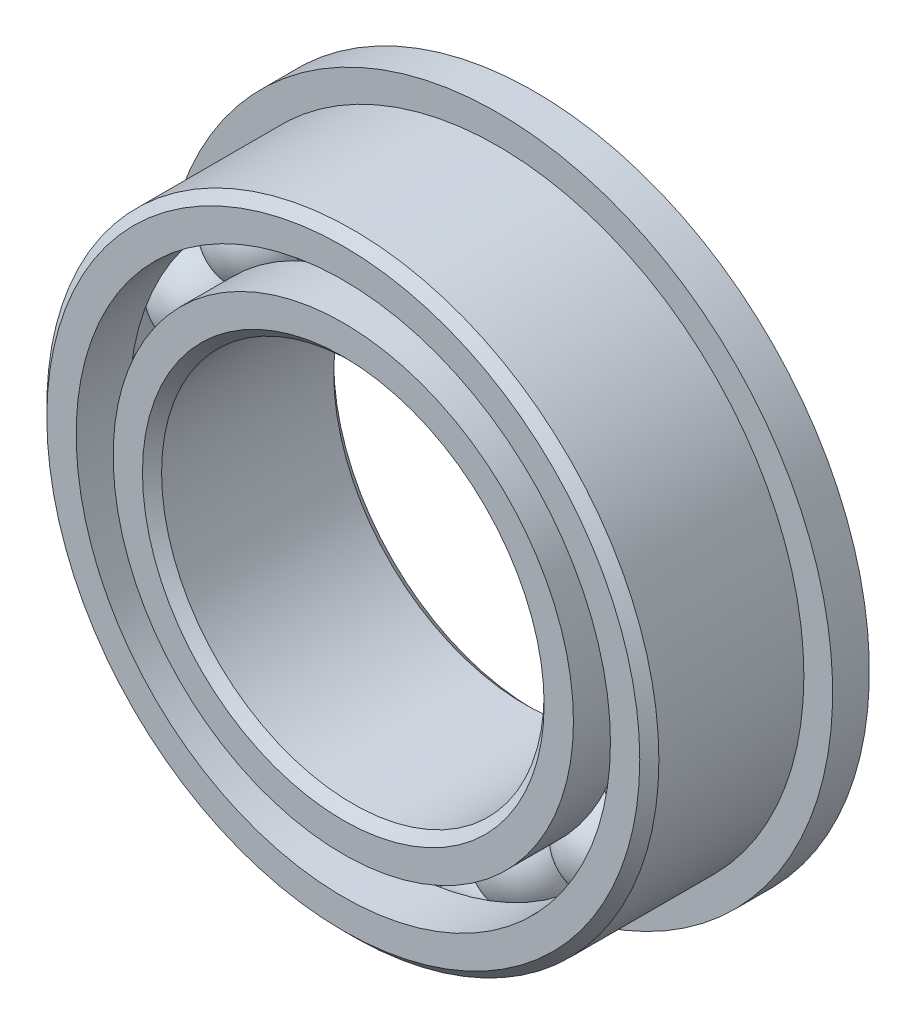
ISO-10303-21;
HEADER;
FILE_DESCRIPTION(('STEP AP214'),'2;1');
FILE_NAME('part.step','',(''),(''),'','','');
FILE_SCHEMA(('AUTOMOTIVE_DESIGN { 1 0 10303 214 1 1 1 1 }'));
ENDSEC;
DATA;
#1=APPLICATION_CONTEXT('core data for automotive mechanical design processes');
#2=APPLICATION_PROTOCOL_DEFINITION('international standard','automotive_design',2000,#1);
#3=PRODUCT_CONTEXT('',#1,'mechanical');
#4=PRODUCT('Part','Part','',(#3));
#5=PRODUCT_RELATED_PRODUCT_CATEGORY('part','',(#4));
#6=PRODUCT_DEFINITION_FORMATION('','',#4);
#7=PRODUCT_DEFINITION_CONTEXT('part definition',#1,'design');
#8=PRODUCT_DEFINITION('design','',#6,#7);
#9=PRODUCT_DEFINITION_SHAPE('','',#8);
#10=(LENGTH_UNIT() NAMED_UNIT(*) SI_UNIT(.MILLI.,.METRE.));
#11=(NAMED_UNIT(*) PLANE_ANGLE_UNIT() SI_UNIT($,.RADIAN.));
#12=(NAMED_UNIT(*) SI_UNIT($,.STERADIAN.) SOLID_ANGLE_UNIT());
#13=UNCERTAINTY_MEASURE_WITH_UNIT(LENGTH_MEASURE(1.E-05),#10,'distance_accuracy_value','');
#14=(GEOMETRIC_REPRESENTATION_CONTEXT(3) GLOBAL_UNCERTAINTY_ASSIGNED_CONTEXT((#13)) GLOBAL_UNIT_ASSIGNED_CONTEXT((#10,
#11,#12)) REPRESENTATION_CONTEXT('',''));
#15=CARTESIAN_POINT('',(0.,0.,0.));
#16=DIRECTION('',(0.,0.,1.));
#17=DIRECTION('',(1.,0.,0.));
#18=AXIS2_PLACEMENT_3D('',#15,#16,#17);
#19=CARTESIAN_POINT('',(-1.97440733385857,4.76664096305045,0.));
#20=DIRECTION('',(0.,0.,1.));
#21=DIRECTION('',(-0.382683432365077,0.923879532511292,0.));
#22=AXIS2_PLACEMENT_3D('',#19,#20,#21);
#23=SPHERICAL_SURFACE('',#22,0.961832467237323);
#24=CARTESIAN_POINT('',(-1.97440733385857,4.76664096305045,0.961832467237324));
#25=VERTEX_POINT('',#24);
#26=VERTEX_LOOP('',#25);
#27=FACE_BOUND('',#26,.T.);
#28=ADVANCED_FACE('F44',(#27),#23,.T.);
#29=CLOSED_SHELL('',(#28));
#30=MANIFOLD_SOLID_BREP('B2',#29);
#31=CARTESIAN_POINT('',(-3.6482290491843,3.64822904918439,0.));
#32=DIRECTION('',(0.,0.,1.));
#33=DIRECTION('',(-0.707106781186539,0.707106781186556,0.));
#34=AXIS2_PLACEMENT_3D('',#31,#32,#33);
#35=SPHERICAL_SURFACE('',#34,0.961832467237323);
#36=CARTESIAN_POINT('',(-3.6482290491843,3.64822904918439,0.961832467237324));
#37=VERTEX_POINT('',#36);
#38=VERTEX_LOOP('',#37);
#39=FACE_BOUND('',#38,.T.);
#40=ADVANCED_FACE('F65',(#39),#35,.T.);
#41=CLOSED_SHELL('',(#40));
#42=MANIFOLD_SOLID_BREP('B6',#41);
#43=CARTESIAN_POINT('',(-4.7666409630504,1.97440733385869,0.));
#44=DIRECTION('',(0.,0.,1.));
#45=DIRECTION('',(-0.923879532511283,0.3826834323651,0.));
#46=AXIS2_PLACEMENT_3D('',#43,#44,#45);
#47=SPHERICAL_SURFACE('',#46,0.961832467237323);
#48=CARTESIAN_POINT('',(-4.7666409630504,1.97440733385869,0.961832467237324));
#49=VERTEX_POINT('',#48);
#50=VERTEX_LOOP('',#49);
#51=FACE_BOUND('',#50,.T.);
#52=ADVANCED_FACE('F86',(#51),#47,.T.);
#53=CLOSED_SHELL('',(#52));
#54=MANIFOLD_SOLID_BREP('B40',#53);
#55=CARTESIAN_POINT('',(-5.159375,0.,0.));
#56=DIRECTION('',(0.,0.,1.));
#57=DIRECTION('',(-1.,0.,0.));
#58=AXIS2_PLACEMENT_3D('',#55,#56,#57);
#59=SPHERICAL_SURFACE('',#58,0.961832467237323);
#60=CARTESIAN_POINT('',(-5.159375,0.,0.961832467237324));
#61=VERTEX_POINT('',#60);
#62=VERTEX_LOOP('',#61);
#63=FACE_BOUND('',#62,.T.);
#64=ADVANCED_FACE('F107',(#63),#59,.T.);
#65=CLOSED_SHELL('',(#64));
#66=MANIFOLD_SOLID_BREP('B61',#65);
#67=CARTESIAN_POINT('',(-4.76664096305044,-1.97440733385859,0.));
#68=DIRECTION('',(0.,0.,1.));
#69=DIRECTION('',(-0.923879532511291,-0.382683432365081,0.));
#70=AXIS2_PLACEMENT_3D('',#67,#68,#69);
#71=SPHERICAL_SURFACE('',#70,0.961832467237323);
#72=CARTESIAN_POINT('',(-4.76664096305044,-1.97440733385859,0.961832467237324));
#73=VERTEX_POINT('',#72);
#74=VERTEX_LOOP('',#73);
#75=FACE_BOUND('',#74,.T.);
#76=ADVANCED_FACE('F128',(#75),#71,.T.);
#77=CLOSED_SHELL('',(#76));
#78=MANIFOLD_SOLID_BREP('B82',#77);
#79=CARTESIAN_POINT('',(-3.64822904918437,-3.64822904918431,0.));
#80=DIRECTION('',(0.,0.,1.));
#81=DIRECTION('',(-0.707106781186554,-0.707106781186541,0.));
#82=AXIS2_PLACEMENT_3D('',#79,#80,#81);
#83=SPHERICAL_SURFACE('',#82,0.961832467237323);
#84=CARTESIAN_POINT('',(-3.64822904918437,-3.64822904918431,0.961832467237324));
#85=VERTEX_POINT('',#84);
#86=VERTEX_LOOP('',#85);
#87=FACE_BOUND('',#86,.T.);
#88=ADVANCED_FACE('F149',(#87),#83,.T.);
#89=CLOSED_SHELL('',(#88));
#90=MANIFOLD_SOLID_BREP('B103',#89);
#91=CARTESIAN_POINT('',(-1.97440733385867,-4.7666409630504,0.));
#92=DIRECTION('',(0.,0.,1.));
#93=DIRECTION('',(-0.382683432365097,-0.923879532511284,0.));
#94=AXIS2_PLACEMENT_3D('',#91,#92,#93);
#95=SPHERICAL_SURFACE('',#94,0.961832467237323);
#96=CARTESIAN_POINT('',(-1.97440733385867,-4.7666409630504,0.961832467237324));
#97=VERTEX_POINT('',#96);
#98=VERTEX_LOOP('',#97);
#99=FACE_BOUND('',#98,.T.);
#100=ADVANCED_FACE('F170',(#99),#95,.T.);
#101=CLOSED_SHELL('',(#100));
#102=MANIFOLD_SOLID_BREP('B124',#101);
#103=CARTESIAN_POINT('',(0.,-5.159375,0.));
#104=DIRECTION('',(0.,0.,1.));
#105=DIRECTION('',(0.,-1.,0.));
#106=AXIS2_PLACEMENT_3D('',#103,#104,#105);
#107=SPHERICAL_SURFACE('',#106,0.961832467237323);
#108=CARTESIAN_POINT('',(0.,-5.159375,0.961832467237324));
#109=VERTEX_POINT('',#108);
#110=VERTEX_LOOP('',#109);
#111=FACE_BOUND('',#110,.T.);
#112=ADVANCED_FACE('F191',(#111),#107,.T.);
#113=CLOSED_SHELL('',(#112));
#114=MANIFOLD_SOLID_BREP('B145',#113);
#115=CARTESIAN_POINT('',(1.97440733385861,-4.76664096305043,0.));
#116=DIRECTION('',(0.,0.,1.));
#117=DIRECTION('',(0.382683432365084,-0.923879532511289,0.));
#118=AXIS2_PLACEMENT_3D('',#115,#116,#117);
#119=SPHERICAL_SURFACE('',#118,0.961832467237323);
#120=CARTESIAN_POINT('',(1.97440733385861,-4.76664096305043,0.961832467237324));
#121=VERTEX_POINT('',#120);
#122=VERTEX_LOOP('',#121);
#123=FACE_BOUND('',#122,.T.);
#124=ADVANCED_FACE('F212',(#123),#119,.T.);
#125=CLOSED_SHELL('',(#124));
#126=MANIFOLD_SOLID_BREP('B166',#125);
#127=CARTESIAN_POINT('',(3.64822904918432,-3.64822904918436,0.));
#128=DIRECTION('',(0.,0.,1.));
#129=DIRECTION('',(0.707106781186544,-0.707106781186551,0.));
#130=AXIS2_PLACEMENT_3D('',#127,#128,#129);
#131=SPHERICAL_SURFACE('',#130,0.961832467237323);
#132=CARTESIAN_POINT('',(3.64822904918432,-3.64822904918436,0.961832467237324));
#133=VERTEX_POINT('',#132);
#134=VERTEX_LOOP('',#133);
#135=FACE_BOUND('',#134,.T.);
#136=ADVANCED_FACE('F233',(#135),#131,.T.);
#137=CLOSED_SHELL('',(#136));
#138=MANIFOLD_SOLID_BREP('B187',#137);
#139=CARTESIAN_POINT('',(4.76664096305041,-1.97440733385866,0.));
#140=DIRECTION('',(0.,0.,1.));
#141=DIRECTION('',(0.923879532511285,-0.382683432365094,0.));
#142=AXIS2_PLACEMENT_3D('',#139,#140,#141);
#143=SPHERICAL_SURFACE('',#142,0.961832467237323);
#144=CARTESIAN_POINT('',(4.76664096305041,-1.97440733385866,0.961832467237324));
#145=VERTEX_POINT('',#144);
#146=VERTEX_LOOP('',#145);
#147=FACE_BOUND('',#146,.T.);
#148=ADVANCED_FACE('F254',(#147),#143,.T.);
#149=CLOSED_SHELL('',(#148));
#150=MANIFOLD_SOLID_BREP('B208',#149);
#151=CARTESIAN_POINT('',(5.159375,0.,0.));
#152=DIRECTION('',(0.,0.,1.));
#153=DIRECTION('',(1.,0.,0.));
#154=AXIS2_PLACEMENT_3D('',#151,#152,#153);
#155=SPHERICAL_SURFACE('',#154,0.961832467237323);
#156=CARTESIAN_POINT('',(5.159375,0.,0.961832467237324));
#157=VERTEX_POINT('',#156);
#158=VERTEX_LOOP('',#157);
#159=FACE_BOUND('',#158,.T.);
#160=ADVANCED_FACE('F275',(#159),#155,.T.);
#161=CLOSED_SHELL('',(#160));
#162=MANIFOLD_SOLID_BREP('B229',#161);
#163=CARTESIAN_POINT('',(4.76664096305042,1.97440733385862,0.));
#164=DIRECTION('',(0.,0.,1.));
#165=DIRECTION('',(0.923879532511288,0.382683432365087,0.));
#166=AXIS2_PLACEMENT_3D('',#163,#164,#165);
#167=SPHERICAL_SURFACE('',#166,0.961832467237323);
#168=CARTESIAN_POINT('',(4.76664096305042,1.97440733385862,0.961832467237324));
#169=VERTEX_POINT('',#168);
#170=VERTEX_LOOP('',#169);
#171=FACE_BOUND('',#170,.T.);
#172=ADVANCED_FACE('F297',(#171),#167,.T.);
#173=CLOSED_SHELL('',(#172));
#174=MANIFOLD_SOLID_BREP('B250',#173);
#175=CARTESIAN_POINT('',(3.64822904918435,3.64822904918434,0.));
#176=DIRECTION('',(0.,0.,1.));
#177=DIRECTION('',(0.707106781186549,0.707106781186546,0.));
#178=AXIS2_PLACEMENT_3D('',#175,#176,#177);
#179=SPHERICAL_SURFACE('',#178,0.961832467237323);
#180=CARTESIAN_POINT('',(3.64822904918435,3.64822904918434,0.961832467237324));
#181=VERTEX_POINT('',#180);
#182=VERTEX_LOOP('',#181);
#183=FACE_BOUND('',#182,.T.);
#184=ADVANCED_FACE('F321',(#183),#179,.T.);
#185=CLOSED_SHELL('',(#184));
#186=MANIFOLD_SOLID_BREP('B271',#185);
#187=CARTESIAN_POINT('',(1.97440733385864,4.76664096305042,0.));
#188=DIRECTION('',(0.,0.,1.));
#189=DIRECTION('',(0.382683432365091,0.923879532511287,0.));
#190=AXIS2_PLACEMENT_3D('',#187,#188,#189);
#191=SPHERICAL_SURFACE('',#190,0.961832467237323);
#192=CARTESIAN_POINT('',(1.97440733385864,4.76664096305042,0.961832467237324));
#193=VERTEX_POINT('',#192);
#194=VERTEX_LOOP('',#193);
#195=FACE_BOUND('',#194,.T.);
#196=ADVANCED_FACE('F342',(#195),#191,.T.);
#197=CLOSED_SHELL('',(#196));
#198=MANIFOLD_SOLID_BREP('B293',#197);
#199=CARTESIAN_POINT('',(0.,5.159375,0.));
#200=DIRECTION('',(0.,0.,1.));
#201=DIRECTION('',(0.,1.,0.));
#202=AXIS2_PLACEMENT_3D('',#199,#200,#201);
#203=SPHERICAL_SURFACE('',#202,0.961832467237323);
#204=CARTESIAN_POINT('',(0.,5.159375,0.961832467237324));
#205=VERTEX_POINT('',#204);
#206=VERTEX_LOOP('',#205);
#207=FACE_BOUND('',#206,.T.);
#208=ADVANCED_FACE('F367',(#207),#203,.T.);
#209=CLOSED_SHELL('',(#208));
#210=MANIFOLD_SOLID_BREP('B317',#209);
#211=CARTESIAN_POINT('',(0.,4.77558379120879,1.984375));
#212=DIRECTION('',(0.,0.,-1.));
#213=DIRECTION('',(-1.,0.,0.));
#214=AXIS2_PLACEMENT_3D('',#211,#212,#213);
#215=PLANE('',#214);
#216=CARTESIAN_POINT('',(0.,0.,1.984375));
#217=DIRECTION('',(0.,0.,1.));
#218=DIRECTION('',(1.,0.,0.));
#219=AXIS2_PLACEMENT_3D('',#216,#217,#218);
#220=CIRCLE('',#219,4.1671875);
#221=CARTESIAN_POINT('',(4.1671875,0.,1.984375));
#222=VERTEX_POINT('',#221);
#223=EDGE_CURVE('E423',#222,#222,#220,.T.);
#224=ORIENTED_EDGE('',*,*,#223,.F.);
#225=EDGE_LOOP('',(#224));
#226=FACE_BOUND('',#225,.T.);
#227=CARTESIAN_POINT('',(0.,0.,1.984375));
#228=DIRECTION('',(0.,0.,1.));
#229=DIRECTION('',(1.,0.,0.));
#230=AXIS2_PLACEMENT_3D('',#227,#228,#229);
#231=CIRCLE('',#230,4.77558379120879);
#232=CARTESIAN_POINT('',(4.77558379120879,0.,1.984375));
#233=VERTEX_POINT('',#232);
#234=EDGE_CURVE('E366',#233,#233,#231,.T.);
#235=ORIENTED_EDGE('',*,*,#234,.T.);
#236=EDGE_LOOP('',(#235));
#237=FACE_BOUND('',#236,.T.);
#238=ADVANCED_FACE('F395',(#226,#237),#215,.F.);
#239=CARTESIAN_POINT('',(0.,0.,1.984375));
#240=DIRECTION('',(0.,0.,1.));
#241=DIRECTION('',(1.,0.,0.));
#242=AXIS2_PLACEMENT_3D('',#239,#240,#241);
#243=CYLINDRICAL_SURFACE('',#242,4.77558379120879);
#244=ORIENTED_EDGE('',*,*,#234,.F.);
#245=EDGE_LOOP('',(#244));
#246=FACE_BOUND('',#245,.T.);
#247=CARTESIAN_POINT('',(0.,0.,0.881944444444445));
#248=DIRECTION('',(0.,0.,1.));
#249=DIRECTION('',(1.,0.,0.));
#250=AXIS2_PLACEMENT_3D('',#247,#248,#249);
#251=CIRCLE('',#250,4.77558379120879);
#252=CARTESIAN_POINT('',(4.77558379120879,0.,0.881944444444445));
#253=VERTEX_POINT('',#252);
#254=EDGE_CURVE('E401',#253,#253,#251,.T.);
#255=ORIENTED_EDGE('',*,*,#254,.T.);
#256=EDGE_LOOP('',(#255));
#257=FACE_BOUND('',#256,.T.);
#258=ADVANCED_FACE('F430',(#246,#257),#243,.T.);
#259=CARTESIAN_POINT('',(0.,0.,0.));
#260=DIRECTION('',(0.,0.,1.));
#261=DIRECTION('',(1.,0.,0.));
#262=AXIS2_PLACEMENT_3D('',#259,#260,#261);
#263=TOROIDAL_SURFACE('',#262,5.159375,0.961832467237322);
#264=ORIENTED_EDGE('',*,*,#254,.F.);
#265=EDGE_LOOP('',(#264));
#266=FACE_BOUND('',#265,.T.);
#267=CARTESIAN_POINT('',(0.,0.,-0.881944444444446));
#268=DIRECTION('',(0.,0.,1.));
#269=DIRECTION('',(1.,0.,0.));
#270=AXIS2_PLACEMENT_3D('',#267,#268,#269);
#271=CIRCLE('',#270,4.77558379120879);
#272=CARTESIAN_POINT('',(4.77558379120879,0.,-0.881944444444446));
#273=VERTEX_POINT('',#272);
#274=EDGE_CURVE('E405',#273,#273,#271,.T.);
#275=ORIENTED_EDGE('',*,*,#274,.T.);
#276=EDGE_LOOP('',(#275));
#277=FACE_BOUND('',#276,.T.);
#278=ADVANCED_FACE('F434',(#266,#277),#263,.F.);
#279=CARTESIAN_POINT('',(0.,0.,1.984375));
#280=DIRECTION('',(0.,0.,1.));
#281=DIRECTION('',(1.,0.,0.));
#282=AXIS2_PLACEMENT_3D('',#279,#280,#281);
#283=CYLINDRICAL_SURFACE('',#282,4.77558379120879);
#284=ORIENTED_EDGE('',*,*,#274,.F.);
#285=EDGE_LOOP('',(#284));
#286=FACE_BOUND('',#285,.T.);
#287=CARTESIAN_POINT('',(0.,0.,-1.984375));
#288=DIRECTION('',(0.,0.,1.));
#289=DIRECTION('',(1.,0.,0.));
#290=AXIS2_PLACEMENT_3D('',#287,#288,#289);
#291=CIRCLE('',#290,4.77558379120879);
#292=CARTESIAN_POINT('',(4.77558379120879,0.,-1.984375));
#293=VERTEX_POINT('',#292);
#294=EDGE_CURVE('E409',#293,#293,#291,.T.);
#295=ORIENTED_EDGE('',*,*,#294,.T.);
#296=EDGE_LOOP('',(#295));
#297=FACE_BOUND('',#296,.T.);
#298=ADVANCED_FACE('F439',(#286,#297),#283,.T.);
#299=CARTESIAN_POINT('',(0.,4.1671875,-1.984375));
#300=DIRECTION('',(0.,0.,1.));
#301=DIRECTION('',(1.,0.,0.));
#302=AXIS2_PLACEMENT_3D('',#299,#300,#301);
#303=PLANE('',#302);
#304=ORIENTED_EDGE('',*,*,#294,.F.);
#305=EDGE_LOOP('',(#304));
#306=FACE_BOUND('',#305,.T.);
#307=CARTESIAN_POINT('',(0.,0.,-1.984375));
#308=DIRECTION('',(0.,0.,1.));
#309=DIRECTION('',(1.,0.,0.));
#310=AXIS2_PLACEMENT_3D('',#307,#308,#309);
#311=CIRCLE('',#310,4.1671875);
#312=CARTESIAN_POINT('',(4.1671875,0.,-1.984375));
#313=VERTEX_POINT('',#312);
#314=EDGE_CURVE('E414',#313,#313,#311,.T.);
#315=ORIENTED_EDGE('',*,*,#314,.T.);
#316=EDGE_LOOP('',(#315));
#317=FACE_BOUND('',#316,.T.);
#318=ADVANCED_FACE('F445',(#306,#317),#303,.F.);
#319=CARTESIAN_POINT('',(0.,0.,-1.7859375));
#320=DIRECTION('',(0.,0.,-1.));
#321=DIRECTION('',(-1.,0.,0.));
#322=AXIS2_PLACEMENT_3D('',#319,#320,#321);
#323=CONICAL_SURFACE('',#322,3.96875,0.785398163397444);
#324=ORIENTED_EDGE('',*,*,#314,.F.);
#325=EDGE_LOOP('',(#324));
#326=FACE_BOUND('',#325,.T.);
#327=CARTESIAN_POINT('',(0.,0.,-1.7859375));
#328=DIRECTION('',(0.,0.,1.));
#329=DIRECTION('',(1.,0.,0.));
#330=AXIS2_PLACEMENT_3D('',#327,#328,#329);
#331=CIRCLE('',#330,3.96875);
#332=CARTESIAN_POINT('',(3.96875,0.,-1.7859375));
#333=VERTEX_POINT('',#332);
#334=EDGE_CURVE('E417',#333,#333,#331,.T.);
#335=ORIENTED_EDGE('',*,*,#334,.T.);
#336=EDGE_LOOP('',(#335));
#337=FACE_BOUND('',#336,.T.);
#338=ADVANCED_FACE('F449',(#326,#337),#323,.F.);
#339=CARTESIAN_POINT('',(0.,0.,1.984375));
#340=DIRECTION('',(0.,0.,1.));
#341=DIRECTION('',(1.,0.,0.));
#342=AXIS2_PLACEMENT_3D('',#339,#340,#341);
#343=CYLINDRICAL_SURFACE('',#342,3.96875);
#344=ORIENTED_EDGE('',*,*,#334,.F.);
#345=EDGE_LOOP('',(#344));
#346=FACE_BOUND('',#345,.T.);
#347=CARTESIAN_POINT('',(0.,0.,1.7859375));
#348=DIRECTION('',(0.,0.,1.));
#349=DIRECTION('',(1.,0.,0.));
#350=AXIS2_PLACEMENT_3D('',#347,#348,#349);
#351=CIRCLE('',#350,3.96875);
#352=CARTESIAN_POINT('',(3.96875,0.,1.7859375));
#353=VERTEX_POINT('',#352);
#354=EDGE_CURVE('E420',#353,#353,#351,.T.);
#355=ORIENTED_EDGE('',*,*,#354,.T.);
#356=EDGE_LOOP('',(#355));
#357=FACE_BOUND('',#356,.T.);
#358=ADVANCED_FACE('F453',(#346,#357),#343,.F.);
#359=CARTESIAN_POINT('',(0.,0.,1.984375));
#360=DIRECTION('',(0.,0.,1.));
#361=DIRECTION('',(1.,0.,0.));
#362=AXIS2_PLACEMENT_3D('',#359,#360,#361);
#363=CONICAL_SURFACE('',#362,4.1671875,0.785398163397451);
#364=ORIENTED_EDGE('',*,*,#354,.F.);
#365=EDGE_LOOP('',(#364));
#366=FACE_BOUND('',#365,.T.);
#367=ORIENTED_EDGE('',*,*,#223,.T.);
#368=EDGE_LOOP('',(#367));
#369=FACE_BOUND('',#368,.T.);
#370=ADVANCED_FACE('F427',(#366,#369),#363,.F.);
#371=CLOSED_SHELL('',(#238,#258,#278,#298,#318,#338,#358,#370));
#372=MANIFOLD_SOLID_BREP('B338',#371);
#373=CARTESIAN_POINT('',(0.,0.,1.7859375));
#374=DIRECTION('',(0.,0.,-1.));
#375=DIRECTION('',(-1.,0.,0.));
#376=AXIS2_PLACEMENT_3D('',#373,#374,#375);
#377=CONICAL_SURFACE('',#376,6.35,0.785398163397445);
#378=CARTESIAN_POINT('',(0.,0.,1.984375));
#379=DIRECTION('',(0.,0.,1.));
#380=DIRECTION('',(1.,0.,0.));
#381=AXIS2_PLACEMENT_3D('',#378,#379,#380);
#382=CIRCLE('',#381,6.1515625);
#383=CARTESIAN_POINT('',(6.1515625,0.,1.984375));
#384=VERTEX_POINT('',#383);
#385=EDGE_CURVE('E545',#384,#384,#382,.T.);
#386=ORIENTED_EDGE('',*,*,#385,.F.);
#387=EDGE_LOOP('',(#386));
#388=FACE_BOUND('',#387,.T.);
#389=CARTESIAN_POINT('',(0.,0.,1.7859375));
#390=DIRECTION('',(0.,0.,1.));
#391=DIRECTION('',(1.,0.,0.));
#392=AXIS2_PLACEMENT_3D('',#389,#390,#391);
#393=CIRCLE('',#392,6.35);
#394=CARTESIAN_POINT('',(6.35,0.,1.7859375));
#395=VERTEX_POINT('',#394);
#396=EDGE_CURVE('E394',#395,#395,#393,.T.);
#397=ORIENTED_EDGE('',*,*,#396,.T.);
#398=EDGE_LOOP('',(#397));
#399=FACE_BOUND('',#398,.T.);
#400=ADVANCED_FACE('F523',(#388,#399),#377,.T.);
#401=CARTESIAN_POINT('',(0.,0.,1.984375));
#402=DIRECTION('',(0.,0.,1.));
#403=DIRECTION('',(1.,0.,0.));
#404=AXIS2_PLACEMENT_3D('',#401,#402,#403);
#405=CYLINDRICAL_SURFACE('',#404,6.35);
#406=CARTESIAN_POINT('',(0.,0.,-1.222375));
#407=DIRECTION('',(0.,0.,1.));
#408=DIRECTION('',(1.,0.,0.));
#409=AXIS2_PLACEMENT_3D('',#406,#407,#408);
#410=CIRCLE('',#409,6.35);
#411=CARTESIAN_POINT('',(6.35,0.,-1.222375));
#412=VERTEX_POINT('',#411);
#413=EDGE_CURVE('E548',#412,#412,#410,.T.);
#414=ORIENTED_EDGE('',*,*,#413,.T.);
#415=EDGE_LOOP('',(#414));
#416=FACE_BOUND('',#415,.T.);
#417=ORIENTED_EDGE('',*,*,#396,.F.);
#418=EDGE_LOOP('',(#417));
#419=FACE_BOUND('',#418,.T.);
#420=ADVANCED_FACE('F568',(#416,#419),#405,.T.);
#421=CARTESIAN_POINT('',(0.,6.1515625,-1.984375));
#422=DIRECTION('',(0.,0.,1.));
#423=DIRECTION('',(1.,0.,0.));
#424=AXIS2_PLACEMENT_3D('',#421,#422,#423);
#425=PLANE('',#424);
#426=CARTESIAN_POINT('',(0.,0.,-1.984375));
#427=DIRECTION('',(0.,0.,1.));
#428=DIRECTION('',(1.,0.,0.));
#429=AXIS2_PLACEMENT_3D('',#426,#427,#428);
#430=CIRCLE('',#429,5.54316620879121);
#431=CARTESIAN_POINT('',(5.54316620879121,0.,-1.984375));
#432=VERTEX_POINT('',#431);
#433=EDGE_CURVE('E529',#432,#432,#430,.T.);
#434=ORIENTED_EDGE('',*,*,#433,.T.);
#435=EDGE_LOOP('',(#434));
#436=FACE_BOUND('',#435,.T.);
#437=CARTESIAN_POINT('',(0.,0.,-1.984375));
#438=DIRECTION('',(0.,0.,-1.));
#439=DIRECTION('',(-1.,0.,0.));
#440=AXIS2_PLACEMENT_3D('',#437,#438,#439);
#441=CIRCLE('',#440,6.9469);
#442=CARTESIAN_POINT('',(-6.9469,0.,-1.984375));
#443=VERTEX_POINT('',#442);
#444=EDGE_CURVE('E551',#443,#443,#441,.T.);
#445=ORIENTED_EDGE('',*,*,#444,.T.);
#446=EDGE_LOOP('',(#445));
#447=FACE_BOUND('',#446,.T.);
#448=ADVANCED_FACE('F571',(#436,#447),#425,.F.);
#449=CARTESIAN_POINT('',(0.,0.,1.984375));
#450=DIRECTION('',(0.,0.,1.));
#451=DIRECTION('',(1.,0.,0.));
#452=AXIS2_PLACEMENT_3D('',#449,#450,#451);
#453=CYLINDRICAL_SURFACE('',#452,5.54316620879121);
#454=CARTESIAN_POINT('',(0.,0.,-0.881944444444444));
#455=DIRECTION('',(0.,0.,1.));
#456=DIRECTION('',(1.,0.,0.));
#457=AXIS2_PLACEMENT_3D('',#454,#455,#456);
#458=CIRCLE('',#457,5.54316620879121);
#459=CARTESIAN_POINT('',(5.54316620879121,0.,-0.881944444444444));
#460=VERTEX_POINT('',#459);
#461=EDGE_CURVE('E533',#460,#460,#458,.T.);
#462=ORIENTED_EDGE('',*,*,#461,.T.);
#463=EDGE_LOOP('',(#462));
#464=FACE_BOUND('',#463,.T.);
#465=ORIENTED_EDGE('',*,*,#433,.F.);
#466=EDGE_LOOP('',(#465));
#467=FACE_BOUND('',#466,.T.);
#468=ADVANCED_FACE('F576',(#464,#467),#453,.F.);
#469=CARTESIAN_POINT('',(0.,0.,0.));
#470=DIRECTION('',(0.,0.,1.));
#471=DIRECTION('',(1.,0.,0.));
#472=AXIS2_PLACEMENT_3D('',#469,#470,#471);
#473=TOROIDAL_SURFACE('',#472,5.159375,0.961832467237323);
#474=ORIENTED_EDGE('',*,*,#461,.F.);
#475=EDGE_LOOP('',(#474));
#476=FACE_BOUND('',#475,.T.);
#477=CARTESIAN_POINT('',(0.,0.,0.881944444444445));
#478=DIRECTION('',(0.,0.,1.));
#479=DIRECTION('',(1.,0.,0.));
#480=AXIS2_PLACEMENT_3D('',#477,#478,#479);
#481=CIRCLE('',#480,5.54316620879121);
#482=CARTESIAN_POINT('',(5.54316620879121,0.,0.881944444444445));
#483=VERTEX_POINT('',#482);
#484=EDGE_CURVE('E537',#483,#483,#481,.T.);
#485=ORIENTED_EDGE('',*,*,#484,.T.);
#486=EDGE_LOOP('',(#485));
#487=FACE_BOUND('',#486,.T.);
#488=ADVANCED_FACE('F582',(#476,#487),#473,.F.);
#489=CARTESIAN_POINT('',(0.,0.,1.984375));
#490=DIRECTION('',(0.,0.,1.));
#491=DIRECTION('',(1.,0.,0.));
#492=AXIS2_PLACEMENT_3D('',#489,#490,#491);
#493=CYLINDRICAL_SURFACE('',#492,5.54316620879121);
#494=ORIENTED_EDGE('',*,*,#484,.F.);
#495=EDGE_LOOP('',(#494));
#496=FACE_BOUND('',#495,.T.);
#497=CARTESIAN_POINT('',(0.,0.,1.984375));
#498=DIRECTION('',(0.,0.,1.));
#499=DIRECTION('',(1.,0.,0.));
#500=AXIS2_PLACEMENT_3D('',#497,#498,#499);
#501=CIRCLE('',#500,5.54316620879121);
#502=CARTESIAN_POINT('',(5.54316620879121,0.,1.984375));
#503=VERTEX_POINT('',#502);
#504=EDGE_CURVE('E542',#503,#503,#501,.T.);
#505=ORIENTED_EDGE('',*,*,#504,.T.);
#506=EDGE_LOOP('',(#505));
#507=FACE_BOUND('',#506,.T.);
#508=ADVANCED_FACE('F586',(#496,#507),#493,.F.);
#509=CARTESIAN_POINT('',(0.,6.1515625,1.984375));
#510=DIRECTION('',(0.,0.,-1.));
#511=DIRECTION('',(-1.,0.,0.));
#512=AXIS2_PLACEMENT_3D('',#509,#510,#511);
#513=PLANE('',#512);
#514=ORIENTED_EDGE('',*,*,#504,.F.);
#515=EDGE_LOOP('',(#514));
#516=FACE_BOUND('',#515,.T.);
#517=ORIENTED_EDGE('',*,*,#385,.T.);
#518=EDGE_LOOP('',(#517));
#519=FACE_BOUND('',#518,.T.);
#520=ADVANCED_FACE('F564',(#516,#519),#513,.F.);
#521=CARTESIAN_POINT('',(0.,5.54316620879121,-1.222375));
#522=DIRECTION('',(0.,0.,1.));
#523=DIRECTION('',(1.,0.,0.));
#524=AXIS2_PLACEMENT_3D('',#521,#522,#523);
#525=PLANE('',#524);
#526=CARTESIAN_POINT('',(0.,0.,-1.222375));
#527=DIRECTION('',(0.,0.,-1.));
#528=DIRECTION('',(-1.,0.,0.));
#529=AXIS2_PLACEMENT_3D('',#526,#527,#528);
#530=CIRCLE('',#529,6.9469);
#531=CARTESIAN_POINT('',(-6.9469,0.,-1.222375));
#532=VERTEX_POINT('',#531);
#533=EDGE_CURVE('E554',#532,#532,#530,.T.);
#534=ORIENTED_EDGE('',*,*,#533,.F.);
#535=EDGE_LOOP('',(#534));
#536=FACE_BOUND('',#535,.T.);
#537=ORIENTED_EDGE('',*,*,#413,.F.);
#538=EDGE_LOOP('',(#537));
#539=FACE_BOUND('',#538,.T.);
#540=ADVANCED_FACE('F561',(#536,#539),#525,.T.);
#541=CARTESIAN_POINT('',(0.,0.,-1.984375));
#542=DIRECTION('',(0.,0.,-1.));
#543=DIRECTION('',(-1.,0.,0.));
#544=AXIS2_PLACEMENT_3D('',#541,#542,#543);
#545=CYLINDRICAL_SURFACE('',#544,6.9469);
#546=ORIENTED_EDGE('',*,*,#533,.T.);
#547=EDGE_LOOP('',(#546));
#548=FACE_BOUND('',#547,.T.);
#549=ORIENTED_EDGE('',*,*,#444,.F.);
#550=EDGE_LOOP('',(#549));
#551=FACE_BOUND('',#550,.T.);
#552=ADVANCED_FACE('F558',(#548,#551),#545,.T.);
#553=CLOSED_SHELL('',(#400,#420,#448,#468,#488,#508,#520,#540,#552));
#554=MANIFOLD_SOLID_BREP('B361',#553);
#555=ADVANCED_BREP_SHAPE_REPRESENTATION('',(#18,#30,#42,#54,#66,#78,#90,#102,#114,#126,#138,
#150,#162,#174,#186,#198,#210,#372,#554),#14);
#556=SHAPE_DEFINITION_REPRESENTATION(#9,#555);
ENDSEC;
END-ISO-10303-21;
